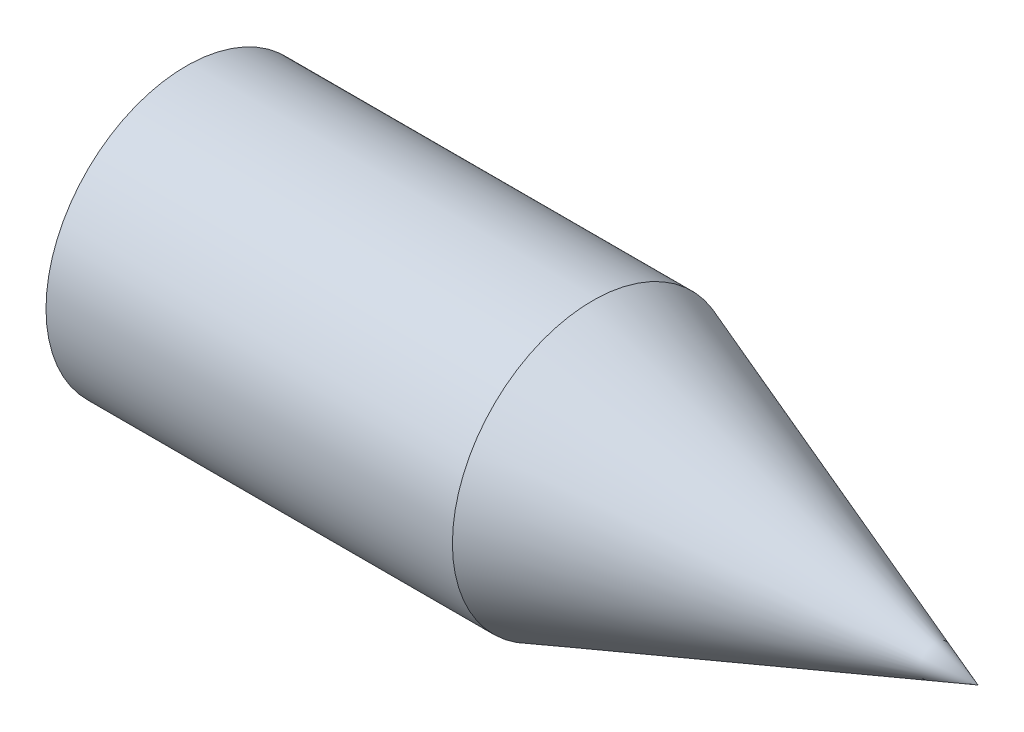
ISO-10303-21;
HEADER;
FILE_DESCRIPTION(('STEP AP214'),'2;1');
FILE_NAME('part.step','',(''),(''),'','','');
FILE_SCHEMA(('AUTOMOTIVE_DESIGN { 1 0 10303 214 1 1 1 1 }'));
ENDSEC;
DATA;
#1=APPLICATION_CONTEXT('core data for automotive mechanical design processes');
#2=APPLICATION_PROTOCOL_DEFINITION('international standard','automotive_design',2000,#1);
#3=PRODUCT_CONTEXT('',#1,'mechanical');
#4=PRODUCT('Part','Part','',(#3));
#5=PRODUCT_RELATED_PRODUCT_CATEGORY('part','',(#4));
#6=PRODUCT_DEFINITION_FORMATION('','',#4);
#7=PRODUCT_DEFINITION_CONTEXT('part definition',#1,'design');
#8=PRODUCT_DEFINITION('design','',#6,#7);
#9=PRODUCT_DEFINITION_SHAPE('','',#8);
#10=(LENGTH_UNIT() NAMED_UNIT(*) SI_UNIT(.MILLI.,.METRE.));
#11=(NAMED_UNIT(*) PLANE_ANGLE_UNIT() SI_UNIT($,.RADIAN.));
#12=(NAMED_UNIT(*) SI_UNIT($,.STERADIAN.) SOLID_ANGLE_UNIT());
#13=UNCERTAINTY_MEASURE_WITH_UNIT(LENGTH_MEASURE(1.E-05),#10,'distance_accuracy_value','');
#14=(GEOMETRIC_REPRESENTATION_CONTEXT(3) GLOBAL_UNCERTAINTY_ASSIGNED_CONTEXT((#13)) GLOBAL_UNIT_ASSIGNED_CONTEXT((#10,
#11,#12)) REPRESENTATION_CONTEXT('',''));
#15=CARTESIAN_POINT('',(0.,0.,0.));
#16=DIRECTION('',(0.,0.,1.));
#17=DIRECTION('',(1.,0.,0.));
#18=AXIS2_PLACEMENT_3D('',#15,#16,#17);
#19=CARTESIAN_POINT('',(0.,0.,0.));
#20=DIRECTION('',(-1.,0.,0.));
#21=DIRECTION('',(0.,0.,1.));
#22=AXIS2_PLACEMENT_3D('',#19,#20,#21);
#23=CYLINDRICAL_SURFACE('',#22,5.);
#24=CARTESIAN_POINT('',(16.,0.,0.));
#25=DIRECTION('',(-1.,0.,0.));
#26=DIRECTION('',(0.,0.,1.));
#27=AXIS2_PLACEMENT_3D('',#24,#25,#26);
#28=CIRCLE('',#27,5.);
#29=CARTESIAN_POINT('',(16.,0.,5.));
#30=VERTEX_POINT('',#29);
#31=EDGE_CURVE('E74',#30,#30,#28,.T.);
#32=ORIENTED_EDGE('',*,*,#31,.F.);
#33=EDGE_LOOP('',(#32));
#34=FACE_BOUND('',#33,.T.);
#35=CARTESIAN_POINT('',(0.,0.,0.));
#36=DIRECTION('',(-1.,0.,0.));
#37=DIRECTION('',(0.,0.,1.));
#38=AXIS2_PLACEMENT_3D('',#35,#36,#37);
#39=CIRCLE('',#38,5.);
#40=CARTESIAN_POINT('',(0.,0.,5.));
#41=VERTEX_POINT('',#40);
#42=EDGE_CURVE('E11',#41,#41,#39,.T.);
#43=ORIENTED_EDGE('',*,*,#42,.T.);
#44=EDGE_LOOP('',(#43));
#45=FACE_BOUND('',#44,.T.);
#46=ADVANCED_FACE('F39',(#34,#45),#23,.F.);
#47=CARTESIAN_POINT('',(0.,5.,0.));
#48=DIRECTION('',(1.,0.,0.));
#49=DIRECTION('',(0.,0.,-1.));
#50=AXIS2_PLACEMENT_3D('',#47,#48,#49);
#51=PLANE('',#50);
#52=ORIENTED_EDGE('',*,*,#42,.F.);
#53=EDGE_LOOP('',(#52));
#54=FACE_BOUND('',#53,.T.);
#55=CARTESIAN_POINT('',(0.,0.,0.));
#56=DIRECTION('',(-1.,0.,0.));
#57=DIRECTION('',(0.,0.,1.));
#58=AXIS2_PLACEMENT_3D('',#55,#56,#57);
#59=CIRCLE('',#58,6.2);
#60=CARTESIAN_POINT('',(0.,0.,6.2));
#61=VERTEX_POINT('',#60);
#62=EDGE_CURVE('E46',#61,#61,#59,.T.);
#63=ORIENTED_EDGE('',*,*,#62,.T.);
#64=EDGE_LOOP('',(#63));
#65=FACE_BOUND('',#64,.T.);
#66=ADVANCED_FACE('F61',(#54,#65),#51,.F.);
#67=CARTESIAN_POINT('',(0.,0.,0.));
#68=DIRECTION('',(-1.,0.,0.));
#69=DIRECTION('',(0.,0.,1.));
#70=AXIS2_PLACEMENT_3D('',#67,#68,#69);
#71=CYLINDRICAL_SURFACE('',#70,6.2);
#72=ORIENTED_EDGE('',*,*,#62,.F.);
#73=EDGE_LOOP('',(#72));
#74=FACE_BOUND('',#73,.T.);
#75=CARTESIAN_POINT('',(17.9656399993814,0.,0.));
#76=DIRECTION('',(-1.,0.,0.));
#77=DIRECTION('',(0.,0.,1.));
#78=AXIS2_PLACEMENT_3D('',#75,#76,#77);
#79=CIRCLE('',#78,6.2);
#80=CARTESIAN_POINT('',(17.9656399993814,0.,6.2));
#81=VERTEX_POINT('',#80);
#82=EDGE_CURVE('E80',#81,#81,#79,.T.);
#83=ORIENTED_EDGE('',*,*,#82,.T.);
#84=EDGE_LOOP('',(#83));
#85=FACE_BOUND('',#84,.T.);
#86=ADVANCED_FACE('F52',(#74,#85),#71,.T.);
#87=CARTESIAN_POINT('',(35.,0.,0.));
#88=DIRECTION('',(-1.,0.,0.));
#89=DIRECTION('',(0.,0.,1.));
#90=AXIS2_PLACEMENT_3D('',#87,#88,#89);
#91=CONICAL_SURFACE('',#90,0.,0.349065850398867);
#92=ORIENTED_EDGE('',*,*,#82,.F.);
#93=EDGE_LOOP('',(#92));
#94=FACE_BOUND('',#93,.T.);
#95=CARTESIAN_POINT('',(35.,0.,0.));
#96=VERTEX_POINT('',#95);
#97=VERTEX_LOOP('',#96);
#98=FACE_BOUND('',#97,.T.);
#99=ADVANCED_FACE('F49',(#94,#98),#91,.T.);
#100=CARTESIAN_POINT('',(16.,0.,0.));
#101=DIRECTION('',(1.,0.,0.));
#102=DIRECTION('',(0.,0.,-1.));
#103=AXIS2_PLACEMENT_3D('',#100,#101,#102);
#104=PLANE('',#103);
#105=ORIENTED_EDGE('',*,*,#31,.T.);
#106=EDGE_LOOP('',(#105));
#107=FACE_BOUND('',#106,.T.);
#108=ADVANCED_FACE('F51',(#107),#104,.F.);
#109=CLOSED_SHELL('',(#46,#66,#86,#99,#108));
#110=MANIFOLD_SOLID_BREP('B2',#109);
#111=ADVANCED_BREP_SHAPE_REPRESENTATION('',(#18,#110),#14);
#112=SHAPE_DEFINITION_REPRESENTATION(#9,#111);
ENDSEC;
END-ISO-10303-21;
